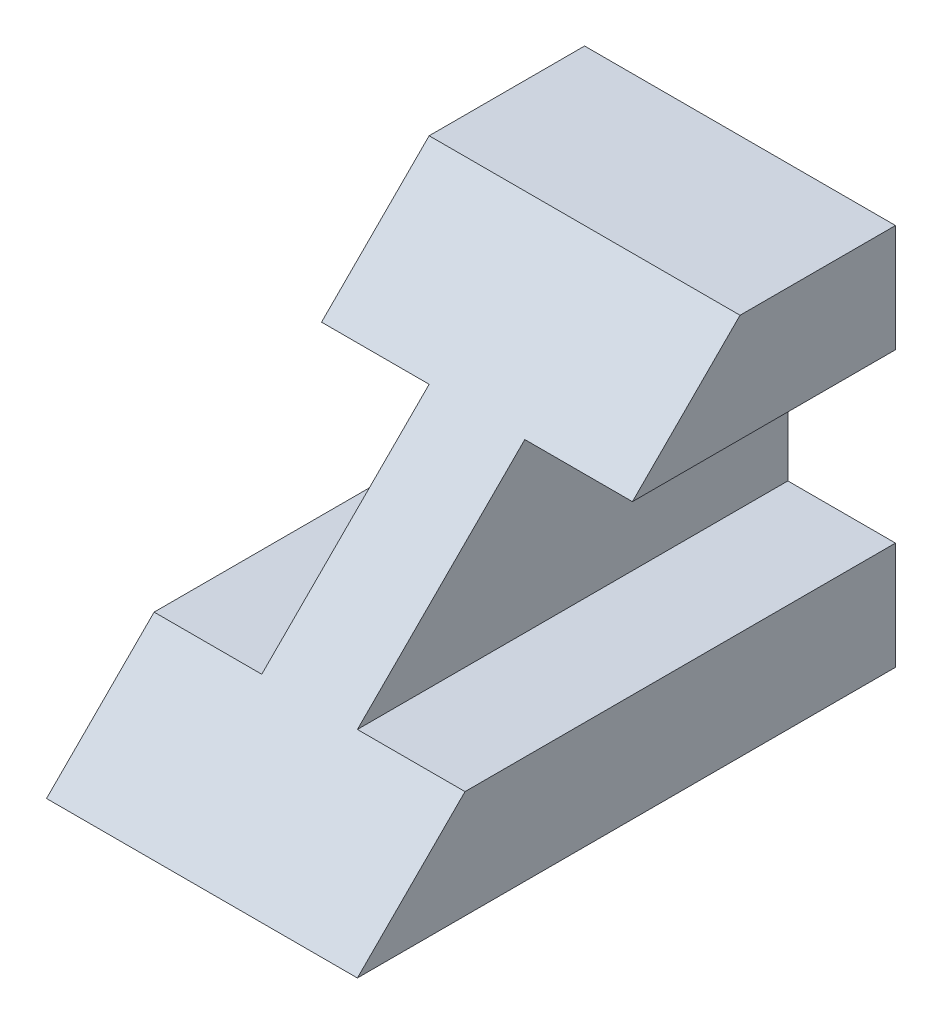
ISO-10303-21;
HEADER;
FILE_DESCRIPTION(('STEP AP214'),'2;1');
FILE_NAME('part.step','',(''),(''),'','','');
FILE_SCHEMA(('AUTOMOTIVE_DESIGN { 1 0 10303 214 1 1 1 1 }'));
ENDSEC;
DATA;
#1=APPLICATION_CONTEXT('core data for automotive mechanical design processes');
#2=APPLICATION_PROTOCOL_DEFINITION('international standard','automotive_design',2000,#1);
#3=PRODUCT_CONTEXT('',#1,'mechanical');
#4=PRODUCT('Part','Part','',(#3));
#5=PRODUCT_RELATED_PRODUCT_CATEGORY('part','',(#4));
#6=PRODUCT_DEFINITION_FORMATION('','',#4);
#7=PRODUCT_DEFINITION_CONTEXT('part definition',#1,'design');
#8=PRODUCT_DEFINITION('design','',#6,#7);
#9=PRODUCT_DEFINITION_SHAPE('','',#8);
#10=(LENGTH_UNIT() NAMED_UNIT(*) SI_UNIT(.MILLI.,.METRE.));
#11=(NAMED_UNIT(*) PLANE_ANGLE_UNIT() SI_UNIT($,.RADIAN.));
#12=(NAMED_UNIT(*) SI_UNIT($,.STERADIAN.) SOLID_ANGLE_UNIT());
#13=UNCERTAINTY_MEASURE_WITH_UNIT(LENGTH_MEASURE(1.E-05),#10,'distance_accuracy_value','');
#14=(GEOMETRIC_REPRESENTATION_CONTEXT(3) GLOBAL_UNCERTAINTY_ASSIGNED_CONTEXT((#13)) GLOBAL_UNIT_ASSIGNED_CONTEXT((#10,
#11,#12)) REPRESENTATION_CONTEXT('',''));
#15=CARTESIAN_POINT('',(0.,0.,0.));
#16=DIRECTION('',(0.,0.,1.));
#17=DIRECTION('',(1.,0.,0.));
#18=AXIS2_PLACEMENT_3D('',#15,#16,#17);
#19=CARTESIAN_POINT('',(13.,0.,0.));
#20=DIRECTION('',(1.,0.,0.));
#21=DIRECTION('',(0.,0.,-1.));
#22=AXIS2_PLACEMENT_3D('',#19,#20,#21);
#23=PLANE('',#22);
#24=DIRECTION('',(0.,0.,1.));
#25=VECTOR('',#24,1.);
#26=CARTESIAN_POINT('',(13.,23.,0.));
#27=LINE('',#26,#25);
#28=CARTESIAN_POINT('',(13.,23.,-45.));
#29=VERTEX_POINT('',#28);
#30=CARTESIAN_POINT('',(13.,23.,-23.));
#31=VERTEX_POINT('',#30);
#32=EDGE_CURVE('E11',#29,#31,#27,.T.);
#33=ORIENTED_EDGE('',*,*,#32,.F.);
#34=DIRECTION('',(0.,1.,0.));
#35=VECTOR('',#34,1.);
#36=CARTESIAN_POINT('',(13.,0.,-45.));
#37=LINE('',#36,#35);
#38=CARTESIAN_POINT('',(13.,32.,-45.));
#39=VERTEX_POINT('',#38);
#40=EDGE_CURVE('E161',#29,#39,#37,.T.);
#41=ORIENTED_EDGE('',*,*,#40,.T.);
#42=DIRECTION('',(0.,0.,1.));
#43=VECTOR('',#42,1.);
#44=CARTESIAN_POINT('',(13.,32.,-45.));
#45=LINE('',#44,#43);
#46=CARTESIAN_POINT('',(13.,32.,-32.));
#47=VERTEX_POINT('',#46);
#48=EDGE_CURVE('E160',#39,#47,#45,.T.);
#49=ORIENTED_EDGE('',*,*,#48,.T.);
#50=DIRECTION('',(0.,-0.707106781186548,0.707106781186548));
#51=VECTOR('',#50,1.);
#52=CARTESIAN_POINT('',(13.,32.,-32.));
#53=LINE('',#52,#51);
#54=EDGE_CURVE('E233',#47,#31,#53,.T.);
#55=ORIENTED_EDGE('',*,*,#54,.T.);
#56=EDGE_LOOP('',(#33,#41,#49,#55));
#57=FACE_BOUND('',#56,.T.);
#58=ADVANCED_FACE('F45',(#57),#23,.T.);
#59=CARTESIAN_POINT('',(-13.,0.,0.));
#60=DIRECTION('',(1.,0.,0.));
#61=DIRECTION('',(0.,0.,-1.));
#62=AXIS2_PLACEMENT_3D('',#59,#60,#61);
#63=PLANE('',#62);
#64=DIRECTION('',(0.,-0.707106781186548,0.707106781186548));
#65=VECTOR('',#64,1.);
#66=CARTESIAN_POINT('',(-13.,32.,-32.));
#67=LINE('',#66,#65);
#68=CARTESIAN_POINT('',(-12.9999999999999,9.,-9.00000000000001));
#69=VERTEX_POINT('',#68);
#70=CARTESIAN_POINT('',(-13.,0.,0.));
#71=VERTEX_POINT('',#70);
#72=EDGE_CURVE('E175',#69,#71,#67,.T.);
#73=ORIENTED_EDGE('',*,*,#72,.F.);
#74=DIRECTION('',(0.,0.,-1.));
#75=VECTOR('',#74,1.);
#76=CARTESIAN_POINT('',(-13.,9.,0.));
#77=LINE('',#76,#75);
#78=CARTESIAN_POINT('',(-12.9999999999999,9.,-45.));
#79=VERTEX_POINT('',#78);
#80=EDGE_CURVE('E142',#69,#79,#77,.T.);
#81=ORIENTED_EDGE('',*,*,#80,.T.);
#82=DIRECTION('',(0.,1.,0.));
#83=VECTOR('',#82,1.);
#84=CARTESIAN_POINT('',(-13.,0.,-45.));
#85=LINE('',#84,#83);
#86=CARTESIAN_POINT('',(-13.,0.,-45.));
#87=VERTEX_POINT('',#86);
#88=EDGE_CURVE('E179',#87,#79,#85,.T.);
#89=ORIENTED_EDGE('',*,*,#88,.F.);
#90=DIRECTION('',(0.,0.,-1.));
#91=VECTOR('',#90,1.);
#92=CARTESIAN_POINT('',(-13.,0.,0.));
#93=LINE('',#92,#91);
#94=EDGE_CURVE('E174',#71,#87,#93,.T.);
#95=ORIENTED_EDGE('',*,*,#94,.F.);
#96=EDGE_LOOP('',(#73,#81,#89,#95));
#97=FACE_BOUND('',#96,.T.);
#98=ADVANCED_FACE('F209',(#97),#63,.F.);
#99=CARTESIAN_POINT('',(13.,32.,-32.));
#100=DIRECTION('',(0.,-0.707106781186548,-0.707106781186548));
#101=DIRECTION('',(0.,0.707106781186548,-0.707106781186548));
#102=AXIS2_PLACEMENT_3D('',#99,#100,#101);
#103=PLANE('',#102);
#104=DIRECTION('',(0.,0.707106781186548,-0.707106781186548));
#105=VECTOR('',#104,1.);
#106=CARTESIAN_POINT('',(4.,32.,-32.));
#107=LINE('',#106,#105);
#108=CARTESIAN_POINT('',(4.,9.,-9.));
#109=VERTEX_POINT('',#108);
#110=CARTESIAN_POINT('',(4.,23.,-23.));
#111=VERTEX_POINT('',#110);
#112=EDGE_CURVE('E224',#109,#111,#107,.T.);
#113=ORIENTED_EDGE('',*,*,#112,.T.);
#114=DIRECTION('',(1.,0.,0.));
#115=VECTOR('',#114,1.);
#116=CARTESIAN_POINT('',(13.,23.,-23.));
#117=LINE('',#116,#115);
#118=EDGE_CURVE('E230',#111,#31,#117,.T.);
#119=ORIENTED_EDGE('',*,*,#118,.T.);
#120=ORIENTED_EDGE('',*,*,#54,.F.);
#121=DIRECTION('',(-1.,0.,0.));
#122=VECTOR('',#121,1.);
#123=CARTESIAN_POINT('',(13.,32.,-32.));
#124=LINE('',#123,#122);
#125=CARTESIAN_POINT('',(-13.,32.,-32.));
#126=VERTEX_POINT('',#125);
#127=EDGE_CURVE('E165',#47,#126,#124,.T.);
#128=ORIENTED_EDGE('',*,*,#127,.T.);
#129=CARTESIAN_POINT('',(-13.,23.,-23.));
#130=VERTEX_POINT('',#129);
#131=EDGE_CURVE('E170',#126,#130,#67,.T.);
#132=ORIENTED_EDGE('',*,*,#131,.T.);
#133=DIRECTION('',(1.,0.,0.));
#134=VECTOR('',#133,1.);
#135=CARTESIAN_POINT('',(13.,23.,-23.));
#136=LINE('',#135,#134);
#137=CARTESIAN_POINT('',(-4.,23.,-23.));
#138=VERTEX_POINT('',#137);
#139=EDGE_CURVE('E69',#130,#138,#136,.T.);
#140=ORIENTED_EDGE('',*,*,#139,.T.);
#141=DIRECTION('',(0.,-0.707106781186548,0.707106781186548));
#142=VECTOR('',#141,1.);
#143=CARTESIAN_POINT('',(-4.,32.,-32.));
#144=LINE('',#143,#142);
#145=CARTESIAN_POINT('',(-4.,8.99999999999999,-8.99999999999999));
#146=VERTEX_POINT('',#145);
#147=EDGE_CURVE('E226',#138,#146,#144,.T.);
#148=ORIENTED_EDGE('',*,*,#147,.T.);
#149=DIRECTION('',(-1.,0.,0.));
#150=VECTOR('',#149,1.);
#151=CARTESIAN_POINT('',(13.,9.,-9.));
#152=LINE('',#151,#150);
#153=EDGE_CURVE('E222',#146,#69,#152,.T.);
#154=ORIENTED_EDGE('',*,*,#153,.T.);
#155=ORIENTED_EDGE('',*,*,#72,.T.);
#156=DIRECTION('',(-1.,0.,0.));
#157=VECTOR('',#156,1.);
#158=CARTESIAN_POINT('',(13.,0.,0.));
#159=LINE('',#158,#157);
#160=CARTESIAN_POINT('',(13.,0.,0.));
#161=VERTEX_POINT('',#160);
#162=EDGE_CURVE('E197',#161,#71,#159,.T.);
#163=ORIENTED_EDGE('',*,*,#162,.F.);
#164=CARTESIAN_POINT('',(13.,9.00000000000001,-9.00000000000001));
#165=VERTEX_POINT('',#164);
#166=EDGE_CURVE('E186',#165,#161,#53,.T.);
#167=ORIENTED_EDGE('',*,*,#166,.F.);
#168=DIRECTION('',(-1.,0.,0.));
#169=VECTOR('',#168,1.);
#170=CARTESIAN_POINT('',(13.,9.,-9.));
#171=LINE('',#170,#169);
#172=EDGE_CURVE('E61',#165,#109,#171,.T.);
#173=ORIENTED_EDGE('',*,*,#172,.T.);
#174=EDGE_LOOP('',(#113,#119,#120,#128,#132,#140,#148,#154,#155,#163,#167,#173));
#175=FACE_BOUND('',#174,.T.);
#176=ADVANCED_FACE('F47',(#175),#103,.F.);
#177=CARTESIAN_POINT('',(13.,0.,0.));
#178=DIRECTION('',(0.,1.,0.));
#179=DIRECTION('',(0.,0.,1.));
#180=AXIS2_PLACEMENT_3D('',#177,#178,#179);
#181=PLANE('',#180);
#182=ORIENTED_EDGE('',*,*,#94,.T.);
#183=DIRECTION('',(-1.,0.,0.));
#184=VECTOR('',#183,1.);
#185=CARTESIAN_POINT('',(13.,0.,-45.));
#186=LINE('',#185,#184);
#187=CARTESIAN_POINT('',(13.,0.,-45.));
#188=VERTEX_POINT('',#187);
#189=EDGE_CURVE('E194',#188,#87,#186,.T.);
#190=ORIENTED_EDGE('',*,*,#189,.F.);
#191=DIRECTION('',(0.,0.,-1.));
#192=VECTOR('',#191,1.);
#193=CARTESIAN_POINT('',(13.,0.,0.));
#194=LINE('',#193,#192);
#195=EDGE_CURVE('E157',#161,#188,#194,.T.);
#196=ORIENTED_EDGE('',*,*,#195,.F.);
#197=ORIENTED_EDGE('',*,*,#162,.T.);
#198=EDGE_LOOP('',(#182,#190,#196,#197));
#199=FACE_BOUND('',#198,.T.);
#200=ADVANCED_FACE('F217',(#199),#181,.F.);
#201=CARTESIAN_POINT('',(13.,0.,-45.));
#202=DIRECTION('',(0.,0.,1.));
#203=DIRECTION('',(1.,0.,0.));
#204=AXIS2_PLACEMENT_3D('',#201,#202,#203);
#205=PLANE('',#204);
#206=ORIENTED_EDGE('',*,*,#40,.F.);
#207=DIRECTION('',(1.,0.,0.));
#208=VECTOR('',#207,1.);
#209=CARTESIAN_POINT('',(13.,23.,-45.));
#210=LINE('',#209,#208);
#211=CARTESIAN_POINT('',(4.,23.,-45.));
#212=VERTEX_POINT('',#211);
#213=EDGE_CURVE('E282',#212,#29,#210,.T.);
#214=ORIENTED_EDGE('',*,*,#213,.F.);
#215=DIRECTION('',(0.,1.,0.));
#216=VECTOR('',#215,1.);
#217=CARTESIAN_POINT('',(4.,23.,-45.));
#218=LINE('',#217,#216);
#219=CARTESIAN_POINT('',(4.,9.,-45.));
#220=VERTEX_POINT('',#219);
#221=EDGE_CURVE('E151',#220,#212,#218,.T.);
#222=ORIENTED_EDGE('',*,*,#221,.F.);
#223=DIRECTION('',(-1.,0.,0.));
#224=VECTOR('',#223,1.);
#225=CARTESIAN_POINT('',(13.,9.,-45.));
#226=LINE('',#225,#224);
#227=CARTESIAN_POINT('',(13.,9.,-45.));
#228=VERTEX_POINT('',#227);
#229=EDGE_CURVE('E136',#228,#220,#226,.T.);
#230=ORIENTED_EDGE('',*,*,#229,.F.);
#231=EDGE_CURVE('E148',#188,#228,#37,.T.);
#232=ORIENTED_EDGE('',*,*,#231,.F.);
#233=ORIENTED_EDGE('',*,*,#189,.T.);
#234=ORIENTED_EDGE('',*,*,#88,.T.);
#235=DIRECTION('',(-1.,0.,0.));
#236=VECTOR('',#235,1.);
#237=CARTESIAN_POINT('',(-12.9999999999999,9.,-45.));
#238=LINE('',#237,#236);
#239=CARTESIAN_POINT('',(-4.,9.,-45.));
#240=VERTEX_POINT('',#239);
#241=EDGE_CURVE('E215',#240,#79,#238,.T.);
#242=ORIENTED_EDGE('',*,*,#241,.F.);
#243=DIRECTION('',(0.,-1.,0.));
#244=VECTOR('',#243,1.);
#245=CARTESIAN_POINT('',(-4.,23.,-45.));
#246=LINE('',#245,#244);
#247=CARTESIAN_POINT('',(-4.,23.,-45.));
#248=VERTEX_POINT('',#247);
#249=EDGE_CURVE('E267',#248,#240,#246,.T.);
#250=ORIENTED_EDGE('',*,*,#249,.F.);
#251=DIRECTION('',(1.,0.,0.));
#252=VECTOR('',#251,1.);
#253=CARTESIAN_POINT('',(-12.9999999999998,23.,-45.));
#254=LINE('',#253,#252);
#255=CARTESIAN_POINT('',(-12.9999999999998,23.,-45.));
#256=VERTEX_POINT('',#255);
#257=EDGE_CURVE('E153',#256,#248,#254,.T.);
#258=ORIENTED_EDGE('',*,*,#257,.F.);
#259=CARTESIAN_POINT('',(-13.,32.,-45.));
#260=VERTEX_POINT('',#259);
#261=EDGE_CURVE('E178',#256,#260,#85,.T.);
#262=ORIENTED_EDGE('',*,*,#261,.T.);
#263=DIRECTION('',(-1.,0.,0.));
#264=VECTOR('',#263,1.);
#265=CARTESIAN_POINT('',(13.,32.,-45.));
#266=LINE('',#265,#264);
#267=EDGE_CURVE('E190',#39,#260,#266,.T.);
#268=ORIENTED_EDGE('',*,*,#267,.F.);
#269=EDGE_LOOP('',(#206,#214,#222,#230,#232,#233,#234,#242,#250,#258,#262,#268));
#270=FACE_BOUND('',#269,.T.);
#271=ADVANCED_FACE('F146',(#270),#205,.F.);
#272=CARTESIAN_POINT('',(13.,32.,-45.));
#273=DIRECTION('',(0.,-1.,0.));
#274=DIRECTION('',(0.,0.,-1.));
#275=AXIS2_PLACEMENT_3D('',#272,#273,#274);
#276=PLANE('',#275);
#277=DIRECTION('',(0.,0.,1.));
#278=VECTOR('',#277,1.);
#279=CARTESIAN_POINT('',(-13.,32.,-45.));
#280=LINE('',#279,#278);
#281=EDGE_CURVE('E183',#260,#126,#280,.T.);
#282=ORIENTED_EDGE('',*,*,#281,.T.);
#283=ORIENTED_EDGE('',*,*,#127,.F.);
#284=ORIENTED_EDGE('',*,*,#48,.F.);
#285=ORIENTED_EDGE('',*,*,#267,.T.);
#286=EDGE_LOOP('',(#282,#283,#284,#285));
#287=FACE_BOUND('',#286,.T.);
#288=ADVANCED_FACE('F250',(#287),#276,.F.);
#289=DIRECTION('',(0.,0.,-1.));
#290=VECTOR('',#289,1.);
#291=CARTESIAN_POINT('',(13.,9.,0.));
#292=LINE('',#291,#290);
#293=EDGE_CURVE('E54',#165,#228,#292,.T.);
#294=ORIENTED_EDGE('',*,*,#293,.F.);
#295=ORIENTED_EDGE('',*,*,#166,.T.);
#296=ORIENTED_EDGE('',*,*,#195,.T.);
#297=ORIENTED_EDGE('',*,*,#231,.T.);
#298=EDGE_LOOP('',(#294,#295,#296,#297));
#299=FACE_BOUND('',#298,.T.);
#300=ADVANCED_FACE('F155',(#299),#23,.T.);
#301=ORIENTED_EDGE('',*,*,#261,.F.);
#302=DIRECTION('',(0.,0.,1.));
#303=VECTOR('',#302,1.);
#304=CARTESIAN_POINT('',(-13.,23.,0.));
#305=LINE('',#304,#303);
#306=EDGE_CURVE('E201',#256,#130,#305,.T.);
#307=ORIENTED_EDGE('',*,*,#306,.T.);
#308=ORIENTED_EDGE('',*,*,#131,.F.);
#309=ORIENTED_EDGE('',*,*,#281,.F.);
#310=EDGE_LOOP('',(#301,#307,#308,#309));
#311=FACE_BOUND('',#310,.T.);
#312=ADVANCED_FACE('F253',(#311),#63,.F.);
#313=CARTESIAN_POINT('',(-4.,23.,0.));
#314=DIRECTION('',(1.,0.,0.));
#315=DIRECTION('',(0.,1.,0.));
#316=AXIS2_PLACEMENT_3D('',#313,#314,#315);
#317=PLANE('',#316);
#318=DIRECTION('',(0.,0.,-1.));
#319=VECTOR('',#318,1.);
#320=CARTESIAN_POINT('',(-4.,23.,0.));
#321=LINE('',#320,#319);
#322=EDGE_CURVE('E273',#138,#248,#321,.T.);
#323=ORIENTED_EDGE('',*,*,#322,.T.);
#324=ORIENTED_EDGE('',*,*,#249,.T.);
#325=DIRECTION('',(0.,0.,-1.));
#326=VECTOR('',#325,1.);
#327=CARTESIAN_POINT('',(-4.,9.,0.));
#328=LINE('',#327,#326);
#329=EDGE_CURVE('E274',#146,#240,#328,.T.);
#330=ORIENTED_EDGE('',*,*,#329,.F.);
#331=ORIENTED_EDGE('',*,*,#147,.F.);
#332=EDGE_LOOP('',(#323,#324,#330,#331));
#333=FACE_BOUND('',#332,.T.);
#334=ADVANCED_FACE('F304',(#333),#317,.F.);
#335=CARTESIAN_POINT('',(-12.9999999999999,9.,0.));
#336=DIRECTION('',(0.,-1.,0.));
#337=DIRECTION('',(0.,0.,-1.));
#338=AXIS2_PLACEMENT_3D('',#335,#336,#337);
#339=PLANE('',#338);
#340=ORIENTED_EDGE('',*,*,#329,.T.);
#341=ORIENTED_EDGE('',*,*,#241,.T.);
#342=ORIENTED_EDGE('',*,*,#80,.F.);
#343=ORIENTED_EDGE('',*,*,#153,.F.);
#344=EDGE_LOOP('',(#340,#341,#342,#343));
#345=FACE_BOUND('',#344,.T.);
#346=ADVANCED_FACE('F357',(#345),#339,.F.);
#347=CARTESIAN_POINT('',(-12.9999999999998,23.,0.));
#348=DIRECTION('',(0.,1.,0.));
#349=DIRECTION('',(0.,0.,1.));
#350=AXIS2_PLACEMENT_3D('',#347,#348,#349);
#351=PLANE('',#350);
#352=ORIENTED_EDGE('',*,*,#306,.F.);
#353=ORIENTED_EDGE('',*,*,#257,.T.);
#354=ORIENTED_EDGE('',*,*,#322,.F.);
#355=ORIENTED_EDGE('',*,*,#139,.F.);
#356=EDGE_LOOP('',(#352,#353,#354,#355));
#357=FACE_BOUND('',#356,.T.);
#358=ADVANCED_FACE('F367',(#357),#351,.F.);
#359=CARTESIAN_POINT('',(4.,23.,0.));
#360=DIRECTION('',(-1.,0.,0.));
#361=DIRECTION('',(0.,-1.,0.));
#362=AXIS2_PLACEMENT_3D('',#359,#360,#361);
#363=PLANE('',#362);
#364=DIRECTION('',(0.,0.,-1.));
#365=VECTOR('',#364,1.);
#366=CARTESIAN_POINT('',(4.,9.,0.));
#367=LINE('',#366,#365);
#368=EDGE_CURVE('E279',#109,#220,#367,.T.);
#369=ORIENTED_EDGE('',*,*,#368,.T.);
#370=ORIENTED_EDGE('',*,*,#221,.T.);
#371=DIRECTION('',(0.,0.,-1.));
#372=VECTOR('',#371,1.);
#373=CARTESIAN_POINT('',(4.,23.,0.));
#374=LINE('',#373,#372);
#375=EDGE_CURVE('E264',#111,#212,#374,.T.);
#376=ORIENTED_EDGE('',*,*,#375,.F.);
#377=ORIENTED_EDGE('',*,*,#112,.F.);
#378=EDGE_LOOP('',(#369,#370,#376,#377));
#379=FACE_BOUND('',#378,.T.);
#380=ADVANCED_FACE('F289',(#379),#363,.F.);
#381=CARTESIAN_POINT('',(13.,23.,0.));
#382=DIRECTION('',(0.,1.,0.));
#383=DIRECTION('',(0.,0.,1.));
#384=AXIS2_PLACEMENT_3D('',#381,#382,#383);
#385=PLANE('',#384);
#386=ORIENTED_EDGE('',*,*,#375,.T.);
#387=ORIENTED_EDGE('',*,*,#213,.T.);
#388=ORIENTED_EDGE('',*,*,#32,.T.);
#389=ORIENTED_EDGE('',*,*,#118,.F.);
#390=EDGE_LOOP('',(#386,#387,#388,#389));
#391=FACE_BOUND('',#390,.T.);
#392=ADVANCED_FACE('F290',(#391),#385,.F.);
#393=CARTESIAN_POINT('',(13.,9.,0.));
#394=DIRECTION('',(0.,-1.,0.));
#395=DIRECTION('',(0.,0.,-1.));
#396=AXIS2_PLACEMENT_3D('',#393,#394,#395);
#397=PLANE('',#396);
#398=ORIENTED_EDGE('',*,*,#293,.T.);
#399=ORIENTED_EDGE('',*,*,#229,.T.);
#400=ORIENTED_EDGE('',*,*,#368,.F.);
#401=ORIENTED_EDGE('',*,*,#172,.F.);
#402=EDGE_LOOP('',(#398,#399,#400,#401));
#403=FACE_BOUND('',#402,.T.);
#404=ADVANCED_FACE('F135',(#403),#397,.F.);
#405=CLOSED_SHELL('',(#58,#98,#176,#200,#271,#288,#300,#312,#334,#346,#358,#380,#392,#404));
#406=MANIFOLD_SOLID_BREP('B2',#405);
#407=ADVANCED_BREP_SHAPE_REPRESENTATION('',(#18,#406),#14);
#408=SHAPE_DEFINITION_REPRESENTATION(#9,#407);
ENDSEC;
END-ISO-10303-21;
